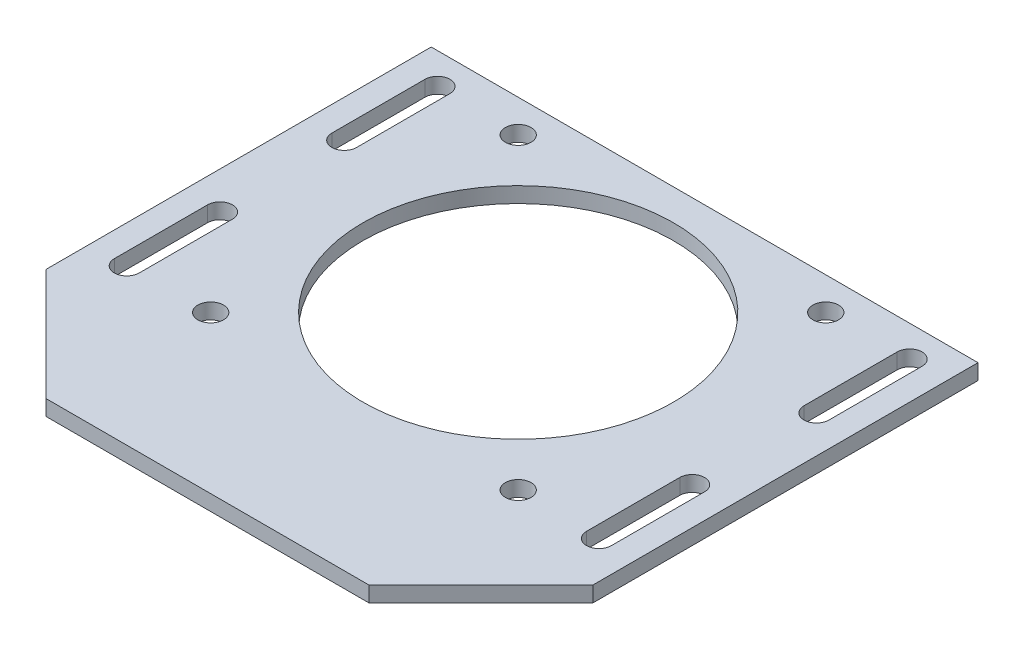
ISO-10303-21;
HEADER;
FILE_DESCRIPTION(('STEP AP214'),'2;1');
FILE_NAME('part.step','',(''),(''),'','','');
FILE_SCHEMA(('AUTOMOTIVE_DESIGN { 1 0 10303 214 1 1 1 1 }'));
ENDSEC;
DATA;
#1=APPLICATION_CONTEXT('core data for automotive mechanical design processes');
#2=APPLICATION_PROTOCOL_DEFINITION('international standard','automotive_design',2000,#1);
#3=PRODUCT_CONTEXT('',#1,'mechanical');
#4=PRODUCT('Part','Part','',(#3));
#5=PRODUCT_RELATED_PRODUCT_CATEGORY('part','',(#4));
#6=PRODUCT_DEFINITION_FORMATION('','',#4);
#7=PRODUCT_DEFINITION_CONTEXT('part definition',#1,'design');
#8=PRODUCT_DEFINITION('design','',#6,#7);
#9=PRODUCT_DEFINITION_SHAPE('','',#8);
#10=(LENGTH_UNIT() NAMED_UNIT(*) SI_UNIT(.MILLI.,.METRE.));
#11=(NAMED_UNIT(*) PLANE_ANGLE_UNIT() SI_UNIT($,.RADIAN.));
#12=(NAMED_UNIT(*) SI_UNIT($,.STERADIAN.) SOLID_ANGLE_UNIT());
#13=UNCERTAINTY_MEASURE_WITH_UNIT(LENGTH_MEASURE(1.E-05),#10,'distance_accuracy_value','');
#14=(GEOMETRIC_REPRESENTATION_CONTEXT(3) GLOBAL_UNCERTAINTY_ASSIGNED_CONTEXT((#13)) GLOBAL_UNIT_ASSIGNED_CONTEXT((#10,
#11,#12)) REPRESENTATION_CONTEXT('',''));
#15=CARTESIAN_POINT('',(0.,0.,0.));
#16=DIRECTION('',(0.,0.,1.));
#17=DIRECTION('',(1.,0.,0.));
#18=AXIS2_PLACEMENT_3D('',#15,#16,#17);
#19=CARTESIAN_POINT('',(0.,0.,0.));
#20=DIRECTION('',(0.,1.,0.));
#21=DIRECTION('',(1.,0.,0.));
#22=AXIS2_PLACEMENT_3D('',#19,#20,#21);
#23=PLANE('',#22);
#24=CARTESIAN_POINT('',(-38.,0.,-20.));
#25=DIRECTION('',(0.,-1.,0.));
#26=DIRECTION('',(1.,0.,0.));
#27=AXIS2_PLACEMENT_3D('',#24,#25,#26);
#28=CIRCLE('',#27,2.);
#29=CARTESIAN_POINT('',(-36.,0.,-20.));
#30=VERTEX_POINT('',#29);
#31=CARTESIAN_POINT('',(-40.,0.,-20.));
#32=VERTEX_POINT('',#31);
#33=EDGE_CURVE('E252',#30,#32,#28,.T.);
#34=ORIENTED_EDGE('',*,*,#33,.F.);
#35=DIRECTION('',(0.,0.,1.));
#36=VECTOR('',#35,1.);
#37=CARTESIAN_POINT('',(-36.,0.,-35.));
#38=LINE('',#37,#36);
#39=CARTESIAN_POINT('',(-36.,0.,-35.));
#40=VERTEX_POINT('',#39);
#41=EDGE_CURVE('E373',#40,#30,#38,.T.);
#42=ORIENTED_EDGE('',*,*,#41,.F.);
#43=CARTESIAN_POINT('',(-38.,0.,-35.));
#44=DIRECTION('',(0.,-1.,0.));
#45=DIRECTION('',(-1.,0.,0.));
#46=AXIS2_PLACEMENT_3D('',#43,#44,#45);
#47=CIRCLE('',#46,2.);
#48=CARTESIAN_POINT('',(-40.,0.,-35.));
#49=VERTEX_POINT('',#48);
#50=EDGE_CURVE('E347',#49,#40,#47,.T.);
#51=ORIENTED_EDGE('',*,*,#50,.F.);
#52=DIRECTION('',(0.,0.,-1.));
#53=VECTOR('',#52,1.);
#54=CARTESIAN_POINT('',(-40.,0.,-20.));
#55=LINE('',#54,#53);
#56=EDGE_CURVE('E462',#32,#49,#55,.T.);
#57=ORIENTED_EDGE('',*,*,#56,.F.);
#58=EDGE_LOOP('',(#34,#42,#51,#57));
#59=FACE_BOUND('',#58,.T.);
#60=CARTESIAN_POINT('',(-38.,0.,15.));
#61=DIRECTION('',(0.,-1.,0.));
#62=DIRECTION('',(1.,0.,0.));
#63=AXIS2_PLACEMENT_3D('',#60,#61,#62);
#64=CIRCLE('',#63,2.);
#65=CARTESIAN_POINT('',(-36.,0.,15.));
#66=VERTEX_POINT('',#65);
#67=CARTESIAN_POINT('',(-40.,0.,15.));
#68=VERTEX_POINT('',#67);
#69=EDGE_CURVE('E216',#66,#68,#64,.T.);
#70=ORIENTED_EDGE('',*,*,#69,.F.);
#71=DIRECTION('',(0.,0.,1.));
#72=VECTOR('',#71,1.);
#73=CARTESIAN_POINT('',(-36.,0.,0.));
#74=LINE('',#73,#72);
#75=CARTESIAN_POINT('',(-36.,0.,0.));
#76=VERTEX_POINT('',#75);
#77=EDGE_CURVE('E221',#76,#66,#74,.T.);
#78=ORIENTED_EDGE('',*,*,#77,.F.);
#79=CARTESIAN_POINT('',(-38.,0.,0.));
#80=DIRECTION('',(0.,-1.,0.));
#81=DIRECTION('',(-1.,0.,0.));
#82=AXIS2_PLACEMENT_3D('',#79,#80,#81);
#83=CIRCLE('',#82,2.);
#84=CARTESIAN_POINT('',(-40.,0.,0.));
#85=VERTEX_POINT('',#84);
#86=EDGE_CURVE('E256',#85,#76,#83,.T.);
#87=ORIENTED_EDGE('',*,*,#86,.F.);
#88=DIRECTION('',(0.,0.,-1.));
#89=VECTOR('',#88,1.);
#90=CARTESIAN_POINT('',(-40.,0.,15.));
#91=LINE('',#90,#89);
#92=EDGE_CURVE('E222',#68,#85,#91,.T.);
#93=ORIENTED_EDGE('',*,*,#92,.F.);
#94=EDGE_LOOP('',(#70,#78,#87,#93));
#95=FACE_BOUND('',#94,.T.);
#96=DIRECTION('',(0.,0.,-1.));
#97=VECTOR('',#96,1.);
#98=CARTESIAN_POINT('',(36.,0.,15.));
#99=LINE('',#98,#97);
#100=CARTESIAN_POINT('',(36.,0.,15.));
#101=VERTEX_POINT('',#100);
#102=CARTESIAN_POINT('',(36.,0.,0.));
#103=VERTEX_POINT('',#102);
#104=EDGE_CURVE('E405',#101,#103,#99,.T.);
#105=ORIENTED_EDGE('',*,*,#104,.F.);
#106=CARTESIAN_POINT('',(38.,0.,15.));
#107=DIRECTION('',(0.,-1.,0.));
#108=DIRECTION('',(1.,0.,0.));
#109=AXIS2_PLACEMENT_3D('',#106,#107,#108);
#110=CIRCLE('',#109,2.);
#111=CARTESIAN_POINT('',(40.,0.,15.));
#112=VERTEX_POINT('',#111);
#113=EDGE_CURVE('E440',#112,#101,#110,.T.);
#114=ORIENTED_EDGE('',*,*,#113,.F.);
#115=DIRECTION('',(0.,0.,1.));
#116=VECTOR('',#115,1.);
#117=CARTESIAN_POINT('',(40.,0.,0.));
#118=LINE('',#117,#116);
#119=CARTESIAN_POINT('',(40.,0.,0.));
#120=VERTEX_POINT('',#119);
#121=EDGE_CURVE('E357',#120,#112,#118,.T.);
#122=ORIENTED_EDGE('',*,*,#121,.F.);
#123=CARTESIAN_POINT('',(38.,0.,0.));
#124=DIRECTION('',(0.,-1.,0.));
#125=DIRECTION('',(-1.,0.,0.));
#126=AXIS2_PLACEMENT_3D('',#123,#124,#125);
#127=CIRCLE('',#126,2.);
#128=EDGE_CURVE('E420',#103,#120,#127,.T.);
#129=ORIENTED_EDGE('',*,*,#128,.F.);
#130=EDGE_LOOP('',(#105,#114,#122,#129));
#131=FACE_BOUND('',#130,.T.);
#132=DIRECTION('',(0.,0.,1.));
#133=VECTOR('',#132,1.);
#134=CARTESIAN_POINT('',(40.,0.,-35.));
#135=LINE('',#134,#133);
#136=CARTESIAN_POINT('',(40.,0.,-35.));
#137=VERTEX_POINT('',#136);
#138=CARTESIAN_POINT('',(40.,0.,-20.));
#139=VERTEX_POINT('',#138);
#140=EDGE_CURVE('E454',#137,#139,#135,.T.);
#141=ORIENTED_EDGE('',*,*,#140,.F.);
#142=CARTESIAN_POINT('',(38.,0.,-35.));
#143=DIRECTION('',(0.,-1.,0.));
#144=DIRECTION('',(-1.,0.,0.));
#145=AXIS2_PLACEMENT_3D('',#142,#143,#144);
#146=CIRCLE('',#145,2.);
#147=CARTESIAN_POINT('',(36.,0.,-35.));
#148=VERTEX_POINT('',#147);
#149=EDGE_CURVE('E268',#148,#137,#146,.T.);
#150=ORIENTED_EDGE('',*,*,#149,.F.);
#151=DIRECTION('',(0.,0.,-1.));
#152=VECTOR('',#151,1.);
#153=CARTESIAN_POINT('',(36.,0.,-20.));
#154=LINE('',#153,#152);
#155=CARTESIAN_POINT('',(36.,0.,-20.));
#156=VERTEX_POINT('',#155);
#157=EDGE_CURVE('E383',#156,#148,#154,.T.);
#158=ORIENTED_EDGE('',*,*,#157,.F.);
#159=CARTESIAN_POINT('',(38.,0.,-20.));
#160=DIRECTION('',(0.,-1.,0.));
#161=DIRECTION('',(1.,0.,0.));
#162=AXIS2_PLACEMENT_3D('',#159,#160,#161);
#163=CIRCLE('',#162,2.);
#164=EDGE_CURVE('E391',#139,#156,#163,.T.);
#165=ORIENTED_EDGE('',*,*,#164,.F.);
#166=EDGE_LOOP('',(#141,#150,#158,#165));
#167=FACE_BOUND('',#166,.T.);
#168=CARTESIAN_POINT('',(0.,0.,-10.));
#169=DIRECTION('',(0.,-1.,0.));
#170=DIRECTION('',(1.,0.,0.));
#171=AXIS2_PLACEMENT_3D('',#168,#169,#170);
#172=CIRCLE('',#171,25.);
#173=CARTESIAN_POINT('',(-25.,0.,-10.));
#174=VERTEX_POINT('',#173);
#175=EDGE_CURVE('E137',#174,#174,#172,.T.);
#176=ORIENTED_EDGE('',*,*,#175,.F.);
#177=EDGE_LOOP('',(#176));
#178=FACE_BOUND('',#177,.T.);
#179=CARTESIAN_POINT('',(24.7487373415292,0.,-34.7487373415292));
#180=DIRECTION('',(0.,1.,0.));
#181=DIRECTION('',(1.,0.,0.));
#182=AXIS2_PLACEMENT_3D('',#179,#180,#181);
#183=CIRCLE('',#182,2.067);
#184=CARTESIAN_POINT('',(22.6817373415292,0.,-34.7487373415292));
#185=VERTEX_POINT('',#184);
#186=EDGE_CURVE('E275',#185,#185,#183,.T.);
#187=ORIENTED_EDGE('',*,*,#186,.T.);
#188=EDGE_LOOP('',(#187));
#189=FACE_BOUND('',#188,.T.);
#190=CARTESIAN_POINT('',(-24.7487373415292,0.,14.7487373415292));
#191=DIRECTION('',(0.,1.,0.));
#192=DIRECTION('',(1.,0.,0.));
#193=AXIS2_PLACEMENT_3D('',#190,#191,#192);
#194=CIRCLE('',#193,2.067);
#195=CARTESIAN_POINT('',(-26.8157373415292,0.,14.7487373415292));
#196=VERTEX_POINT('',#195);
#197=EDGE_CURVE('E261',#196,#196,#194,.T.);
#198=ORIENTED_EDGE('',*,*,#197,.T.);
#199=EDGE_LOOP('',(#198));
#200=FACE_BOUND('',#199,.T.);
#201=CARTESIAN_POINT('',(-24.7487373415292,0.,-34.7487373415292));
#202=DIRECTION('',(0.,1.,0.));
#203=DIRECTION('',(1.,0.,0.));
#204=AXIS2_PLACEMENT_3D('',#201,#202,#203);
#205=CIRCLE('',#204,2.067);
#206=CARTESIAN_POINT('',(-26.8157373415292,0.,-34.7487373415292));
#207=VERTEX_POINT('',#206);
#208=EDGE_CURVE('E322',#207,#207,#205,.T.);
#209=ORIENTED_EDGE('',*,*,#208,.T.);
#210=EDGE_LOOP('',(#209));
#211=FACE_BOUND('',#210,.T.);
#212=CARTESIAN_POINT('',(24.7487373415292,0.,14.7487373415292));
#213=DIRECTION('',(0.,1.,0.));
#214=DIRECTION('',(1.,0.,0.));
#215=AXIS2_PLACEMENT_3D('',#212,#213,#214);
#216=CIRCLE('',#215,2.067);
#217=CARTESIAN_POINT('',(22.6817373415292,0.,14.7487373415292));
#218=VERTEX_POINT('',#217);
#219=EDGE_CURVE('E341',#218,#218,#216,.T.);
#220=ORIENTED_EDGE('',*,*,#219,.T.);
#221=EDGE_LOOP('',(#220));
#222=FACE_BOUND('',#221,.T.);
#223=DIRECTION('',(0.,0.,1.));
#224=VECTOR('',#223,1.);
#225=CARTESIAN_POINT('',(-44.,0.,-40.));
#226=LINE('',#225,#224);
#227=CARTESIAN_POINT('',(-44.,0.,-40.));
#228=VERTEX_POINT('',#227);
#229=CARTESIAN_POINT('',(-44.,0.,22.));
#230=VERTEX_POINT('',#229);
#231=EDGE_CURVE('E28',#228,#230,#226,.T.);
#232=ORIENTED_EDGE('',*,*,#231,.F.);
#233=DIRECTION('',(-1.,0.,0.));
#234=VECTOR('',#233,1.);
#235=CARTESIAN_POINT('',(44.,0.,-40.));
#236=LINE('',#235,#234);
#237=CARTESIAN_POINT('',(44.,0.,-40.));
#238=VERTEX_POINT('',#237);
#239=EDGE_CURVE('E394',#238,#228,#236,.T.);
#240=ORIENTED_EDGE('',*,*,#239,.F.);
#241=DIRECTION('',(0.,0.,-1.));
#242=VECTOR('',#241,1.);
#243=CARTESIAN_POINT('',(44.,0.,22.));
#244=LINE('',#243,#242);
#245=CARTESIAN_POINT('',(44.,0.,22.));
#246=VERTEX_POINT('',#245);
#247=EDGE_CURVE('E276',#246,#238,#244,.T.);
#248=ORIENTED_EDGE('',*,*,#247,.F.);
#249=DIRECTION('',(0.707106781186547,0.,-0.707106781186548));
#250=VECTOR('',#249,1.);
#251=CARTESIAN_POINT('',(26.,0.,40.));
#252=LINE('',#251,#250);
#253=CARTESIAN_POINT('',(26.,0.,40.));
#254=VERTEX_POINT('',#253);
#255=EDGE_CURVE('E333',#254,#246,#252,.T.);
#256=ORIENTED_EDGE('',*,*,#255,.F.);
#257=DIRECTION('',(1.,0.,0.));
#258=VECTOR('',#257,1.);
#259=CARTESIAN_POINT('',(-26.,0.,40.));
#260=LINE('',#259,#258);
#261=CARTESIAN_POINT('',(-26.,0.,40.));
#262=VERTEX_POINT('',#261);
#263=EDGE_CURVE('E346',#262,#254,#260,.T.);
#264=ORIENTED_EDGE('',*,*,#263,.F.);
#265=DIRECTION('',(0.707106781186547,0.,0.707106781186548));
#266=VECTOR('',#265,1.);
#267=CARTESIAN_POINT('',(-44.,0.,22.));
#268=LINE('',#267,#266);
#269=EDGE_CURVE('E361',#230,#262,#268,.T.);
#270=ORIENTED_EDGE('',*,*,#269,.F.);
#271=EDGE_LOOP('',(#232,#240,#248,#256,#264,#270));
#272=FACE_BOUND('',#271,.T.);
#273=ADVANCED_FACE('F17',(#59,#95,#131,#167,#178,#189,#200,#211,#222,#272),#23,.F.);
#274=CARTESIAN_POINT('',(0.,2.5,0.));
#275=DIRECTION('',(0.,1.,0.));
#276=DIRECTION('',(1.,0.,0.));
#277=AXIS2_PLACEMENT_3D('',#274,#275,#276);
#278=PLANE('',#277);
#279=CARTESIAN_POINT('',(-38.,2.5,-20.));
#280=DIRECTION('',(0.,-1.,0.));
#281=DIRECTION('',(1.,0.,0.));
#282=AXIS2_PLACEMENT_3D('',#279,#280,#281);
#283=CIRCLE('',#282,2.);
#284=CARTESIAN_POINT('',(-36.,2.5,-20.));
#285=VERTEX_POINT('',#284);
#286=CARTESIAN_POINT('',(-40.,2.5,-20.));
#287=VERTEX_POINT('',#286);
#288=EDGE_CURVE('E245',#285,#287,#283,.T.);
#289=ORIENTED_EDGE('',*,*,#288,.T.);
#290=DIRECTION('',(0.,0.,-1.));
#291=VECTOR('',#290,1.);
#292=CARTESIAN_POINT('',(-40.,2.5,-20.));
#293=LINE('',#292,#291);
#294=CARTESIAN_POINT('',(-40.,2.5,-35.));
#295=VERTEX_POINT('',#294);
#296=EDGE_CURVE('E401',#287,#295,#293,.T.);
#297=ORIENTED_EDGE('',*,*,#296,.T.);
#298=CARTESIAN_POINT('',(-38.,2.5,-35.));
#299=DIRECTION('',(0.,-1.,0.));
#300=DIRECTION('',(-1.,0.,0.));
#301=AXIS2_PLACEMENT_3D('',#298,#299,#300);
#302=CIRCLE('',#301,2.);
#303=CARTESIAN_POINT('',(-36.,2.5,-35.));
#304=VERTEX_POINT('',#303);
#305=EDGE_CURVE('E351',#295,#304,#302,.T.);
#306=ORIENTED_EDGE('',*,*,#305,.T.);
#307=DIRECTION('',(0.,0.,1.));
#308=VECTOR('',#307,1.);
#309=CARTESIAN_POINT('',(-36.,2.5,-35.));
#310=LINE('',#309,#308);
#311=EDGE_CURVE('E372',#304,#285,#310,.T.);
#312=ORIENTED_EDGE('',*,*,#311,.T.);
#313=EDGE_LOOP('',(#289,#297,#306,#312));
#314=FACE_BOUND('',#313,.T.);
#315=CARTESIAN_POINT('',(-38.,2.5,15.));
#316=DIRECTION('',(0.,-1.,0.));
#317=DIRECTION('',(1.,0.,0.));
#318=AXIS2_PLACEMENT_3D('',#315,#316,#317);
#319=CIRCLE('',#318,2.);
#320=CARTESIAN_POINT('',(-36.,2.5,15.));
#321=VERTEX_POINT('',#320);
#322=CARTESIAN_POINT('',(-40.,2.5,15.));
#323=VERTEX_POINT('',#322);
#324=EDGE_CURVE('E227',#321,#323,#319,.T.);
#325=ORIENTED_EDGE('',*,*,#324,.T.);
#326=DIRECTION('',(0.,0.,-1.));
#327=VECTOR('',#326,1.);
#328=CARTESIAN_POINT('',(-40.,2.5,15.));
#329=LINE('',#328,#327);
#330=CARTESIAN_POINT('',(-40.,2.5,0.));
#331=VERTEX_POINT('',#330);
#332=EDGE_CURVE('E314',#323,#331,#329,.T.);
#333=ORIENTED_EDGE('',*,*,#332,.T.);
#334=CARTESIAN_POINT('',(-38.,2.5,0.));
#335=DIRECTION('',(0.,-1.,0.));
#336=DIRECTION('',(-1.,0.,0.));
#337=AXIS2_PLACEMENT_3D('',#334,#335,#336);
#338=CIRCLE('',#337,2.);
#339=CARTESIAN_POINT('',(-36.,2.5,0.));
#340=VERTEX_POINT('',#339);
#341=EDGE_CURVE('E566',#331,#340,#338,.T.);
#342=ORIENTED_EDGE('',*,*,#341,.T.);
#343=DIRECTION('',(0.,0.,1.));
#344=VECTOR('',#343,1.);
#345=CARTESIAN_POINT('',(-36.,2.5,0.));
#346=LINE('',#345,#344);
#347=EDGE_CURVE('E238',#340,#321,#346,.T.);
#348=ORIENTED_EDGE('',*,*,#347,.T.);
#349=EDGE_LOOP('',(#325,#333,#342,#348));
#350=FACE_BOUND('',#349,.T.);
#351=DIRECTION('',(0.,0.,-1.));
#352=VECTOR('',#351,1.);
#353=CARTESIAN_POINT('',(36.,2.5,15.));
#354=LINE('',#353,#352);
#355=CARTESIAN_POINT('',(36.,2.5,15.));
#356=VERTEX_POINT('',#355);
#357=CARTESIAN_POINT('',(36.,2.5,0.));
#358=VERTEX_POINT('',#357);
#359=EDGE_CURVE('E21',#356,#358,#354,.T.);
#360=ORIENTED_EDGE('',*,*,#359,.T.);
#361=CARTESIAN_POINT('',(38.,2.5,0.));
#362=DIRECTION('',(0.,-1.,0.));
#363=DIRECTION('',(-1.,0.,0.));
#364=AXIS2_PLACEMENT_3D('',#361,#362,#363);
#365=CIRCLE('',#364,2.);
#366=CARTESIAN_POINT('',(40.,2.5,0.));
#367=VERTEX_POINT('',#366);
#368=EDGE_CURVE('E406',#358,#367,#365,.T.);
#369=ORIENTED_EDGE('',*,*,#368,.T.);
#370=DIRECTION('',(0.,0.,1.));
#371=VECTOR('',#370,1.);
#372=CARTESIAN_POINT('',(40.,2.5,0.));
#373=LINE('',#372,#371);
#374=CARTESIAN_POINT('',(40.,2.5,15.));
#375=VERTEX_POINT('',#374);
#376=EDGE_CURVE('E353',#367,#375,#373,.T.);
#377=ORIENTED_EDGE('',*,*,#376,.T.);
#378=CARTESIAN_POINT('',(38.,2.5,15.));
#379=DIRECTION('',(0.,-1.,0.));
#380=DIRECTION('',(1.,0.,0.));
#381=AXIS2_PLACEMENT_3D('',#378,#379,#380);
#382=CIRCLE('',#381,2.);
#383=EDGE_CURVE('E316',#375,#356,#382,.T.);
#384=ORIENTED_EDGE('',*,*,#383,.T.);
#385=EDGE_LOOP('',(#360,#369,#377,#384));
#386=FACE_BOUND('',#385,.T.);
#387=DIRECTION('',(0.,0.,1.));
#388=VECTOR('',#387,1.);
#389=CARTESIAN_POINT('',(40.,2.5,-35.));
#390=LINE('',#389,#388);
#391=CARTESIAN_POINT('',(40.,2.5,-35.));
#392=VERTEX_POINT('',#391);
#393=CARTESIAN_POINT('',(40.,2.5,-20.));
#394=VERTEX_POINT('',#393);
#395=EDGE_CURVE('E416',#392,#394,#390,.T.);
#396=ORIENTED_EDGE('',*,*,#395,.T.);
#397=CARTESIAN_POINT('',(38.,2.5,-20.));
#398=DIRECTION('',(0.,-1.,0.));
#399=DIRECTION('',(1.,0.,0.));
#400=AXIS2_PLACEMENT_3D('',#397,#398,#399);
#401=CIRCLE('',#400,2.);
#402=CARTESIAN_POINT('',(36.,2.5,-20.));
#403=VERTEX_POINT('',#402);
#404=EDGE_CURVE('E428',#394,#403,#401,.T.);
#405=ORIENTED_EDGE('',*,*,#404,.T.);
#406=DIRECTION('',(0.,0.,-1.));
#407=VECTOR('',#406,1.);
#408=CARTESIAN_POINT('',(36.,2.5,-20.));
#409=LINE('',#408,#407);
#410=CARTESIAN_POINT('',(36.,2.5,-35.));
#411=VERTEX_POINT('',#410);
#412=EDGE_CURVE('E379',#403,#411,#409,.T.);
#413=ORIENTED_EDGE('',*,*,#412,.T.);
#414=CARTESIAN_POINT('',(38.,2.5,-35.));
#415=DIRECTION('',(0.,-1.,0.));
#416=DIRECTION('',(-1.,0.,0.));
#417=AXIS2_PLACEMENT_3D('',#414,#415,#416);
#418=CIRCLE('',#417,2.);
#419=EDGE_CURVE('E424',#411,#392,#418,.T.);
#420=ORIENTED_EDGE('',*,*,#419,.T.);
#421=EDGE_LOOP('',(#396,#405,#413,#420));
#422=FACE_BOUND('',#421,.T.);
#423=CARTESIAN_POINT('',(0.,2.5,-10.));
#424=DIRECTION('',(0.,-1.,0.));
#425=DIRECTION('',(1.,0.,0.));
#426=AXIS2_PLACEMENT_3D('',#423,#424,#425);
#427=CIRCLE('',#426,25.);
#428=CARTESIAN_POINT('',(-25.,2.5,-10.));
#429=VERTEX_POINT('',#428);
#430=EDGE_CURVE('E413',#429,#429,#427,.T.);
#431=ORIENTED_EDGE('',*,*,#430,.T.);
#432=EDGE_LOOP('',(#431));
#433=FACE_BOUND('',#432,.T.);
#434=CARTESIAN_POINT('',(24.7487373415292,2.5,-34.7487373415292));
#435=DIRECTION('',(0.,-1.,0.));
#436=DIRECTION('',(1.,0.,0.));
#437=AXIS2_PLACEMENT_3D('',#434,#435,#436);
#438=CIRCLE('',#437,2.067);
#439=CARTESIAN_POINT('',(22.6817373415292,2.5,-34.7487373415292));
#440=VERTEX_POINT('',#439);
#441=EDGE_CURVE('E263',#440,#440,#438,.T.);
#442=ORIENTED_EDGE('',*,*,#441,.T.);
#443=EDGE_LOOP('',(#442));
#444=FACE_BOUND('',#443,.T.);
#445=CARTESIAN_POINT('',(-24.7487373415292,2.5,14.7487373415292));
#446=DIRECTION('',(0.,-1.,0.));
#447=DIRECTION('',(1.,0.,0.));
#448=AXIS2_PLACEMENT_3D('',#445,#446,#447);
#449=CIRCLE('',#448,2.067);
#450=CARTESIAN_POINT('',(-26.8157373415292,2.5,14.7487373415292));
#451=VERTEX_POINT('',#450);
#452=EDGE_CURVE('E262',#451,#451,#449,.T.);
#453=ORIENTED_EDGE('',*,*,#452,.T.);
#454=EDGE_LOOP('',(#453));
#455=FACE_BOUND('',#454,.T.);
#456=CARTESIAN_POINT('',(-24.7487373415292,2.5,-34.7487373415292));
#457=DIRECTION('',(0.,-1.,0.));
#458=DIRECTION('',(1.,0.,0.));
#459=AXIS2_PLACEMENT_3D('',#456,#457,#458);
#460=CIRCLE('',#459,2.067);
#461=CARTESIAN_POINT('',(-26.8157373415292,2.5,-34.7487373415292));
#462=VERTEX_POINT('',#461);
#463=EDGE_CURVE('E337',#462,#462,#460,.T.);
#464=ORIENTED_EDGE('',*,*,#463,.T.);
#465=EDGE_LOOP('',(#464));
#466=FACE_BOUND('',#465,.T.);
#467=CARTESIAN_POINT('',(24.7487373415292,2.5,14.7487373415292));
#468=DIRECTION('',(0.,-1.,0.));
#469=DIRECTION('',(1.,0.,0.));
#470=AXIS2_PLACEMENT_3D('',#467,#468,#469);
#471=CIRCLE('',#470,2.067);
#472=CARTESIAN_POINT('',(22.6817373415292,2.5,14.7487373415292));
#473=VERTEX_POINT('',#472);
#474=EDGE_CURVE('E326',#473,#473,#471,.T.);
#475=ORIENTED_EDGE('',*,*,#474,.T.);
#476=EDGE_LOOP('',(#475));
#477=FACE_BOUND('',#476,.T.);
#478=DIRECTION('',(0.,0.,1.));
#479=VECTOR('',#478,1.);
#480=CARTESIAN_POINT('',(-44.,2.5,-40.));
#481=LINE('',#480,#479);
#482=CARTESIAN_POINT('',(-44.,2.5,-40.));
#483=VERTEX_POINT('',#482);
#484=CARTESIAN_POINT('',(-44.,2.5,22.));
#485=VERTEX_POINT('',#484);
#486=EDGE_CURVE('E11',#483,#485,#481,.T.);
#487=ORIENTED_EDGE('',*,*,#486,.T.);
#488=DIRECTION('',(0.707106781186547,0.,0.707106781186548));
#489=VECTOR('',#488,1.);
#490=CARTESIAN_POINT('',(-44.,2.5,22.));
#491=LINE('',#490,#489);
#492=CARTESIAN_POINT('',(-26.,2.5,40.));
#493=VERTEX_POINT('',#492);
#494=EDGE_CURVE('E358',#485,#493,#491,.T.);
#495=ORIENTED_EDGE('',*,*,#494,.T.);
#496=DIRECTION('',(1.,0.,0.));
#497=VECTOR('',#496,1.);
#498=CARTESIAN_POINT('',(-26.,2.5,40.));
#499=LINE('',#498,#497);
#500=CARTESIAN_POINT('',(26.,2.5,40.));
#501=VERTEX_POINT('',#500);
#502=EDGE_CURVE('E342',#493,#501,#499,.T.);
#503=ORIENTED_EDGE('',*,*,#502,.T.);
#504=DIRECTION('',(0.707106781186547,0.,-0.707106781186548));
#505=VECTOR('',#504,1.);
#506=CARTESIAN_POINT('',(26.,2.5,40.));
#507=LINE('',#506,#505);
#508=CARTESIAN_POINT('',(44.,2.5,22.));
#509=VERTEX_POINT('',#508);
#510=EDGE_CURVE('E336',#501,#509,#507,.T.);
#511=ORIENTED_EDGE('',*,*,#510,.T.);
#512=DIRECTION('',(0.,0.,-1.));
#513=VECTOR('',#512,1.);
#514=CARTESIAN_POINT('',(44.,2.5,22.));
#515=LINE('',#514,#513);
#516=CARTESIAN_POINT('',(44.,2.5,-40.));
#517=VERTEX_POINT('',#516);
#518=EDGE_CURVE('E278',#509,#517,#515,.T.);
#519=ORIENTED_EDGE('',*,*,#518,.T.);
#520=DIRECTION('',(-1.,0.,0.));
#521=VECTOR('',#520,1.);
#522=CARTESIAN_POINT('',(44.,2.5,-40.));
#523=LINE('',#522,#521);
#524=EDGE_CURVE('E292',#517,#483,#523,.T.);
#525=ORIENTED_EDGE('',*,*,#524,.T.);
#526=EDGE_LOOP('',(#487,#495,#503,#511,#519,#525));
#527=FACE_BOUND('',#526,.T.);
#528=ADVANCED_FACE('F501',(#314,#350,#386,#422,#433,#444,#455,#466,#477,#527),#278,.T.);
#529=CARTESIAN_POINT('',(-44.,0.,-40.));
#530=DIRECTION('',(-1.,0.,0.));
#531=DIRECTION('',(0.,1.,0.));
#532=AXIS2_PLACEMENT_3D('',#529,#530,#531);
#533=PLANE('',#532);
#534=ORIENTED_EDGE('',*,*,#231,.T.);
#535=DIRECTION('',(0.,1.,0.));
#536=VECTOR('',#535,1.);
#537=CARTESIAN_POINT('',(-44.,0.,22.));
#538=LINE('',#537,#536);
#539=EDGE_CURVE('E311',#230,#485,#538,.T.);
#540=ORIENTED_EDGE('',*,*,#539,.T.);
#541=ORIENTED_EDGE('',*,*,#486,.F.);
#542=DIRECTION('',(0.,1.,0.));
#543=VECTOR('',#542,1.);
#544=CARTESIAN_POINT('',(-44.,0.,-40.));
#545=LINE('',#544,#543);
#546=EDGE_CURVE('E300',#228,#483,#545,.T.);
#547=ORIENTED_EDGE('',*,*,#546,.F.);
#548=EDGE_LOOP('',(#534,#540,#541,#547));
#549=FACE_BOUND('',#548,.T.);
#550=ADVANCED_FACE('F708',(#549),#533,.T.);
#551=CARTESIAN_POINT('',(-44.,0.,22.));
#552=DIRECTION('',(-0.707106781186548,0.,0.707106781186547));
#553=DIRECTION('',(0.,1.,0.));
#554=AXIS2_PLACEMENT_3D('',#551,#552,#553);
#555=PLANE('',#554);
#556=ORIENTED_EDGE('',*,*,#269,.T.);
#557=DIRECTION('',(0.,1.,0.));
#558=VECTOR('',#557,1.);
#559=CARTESIAN_POINT('',(-26.,0.,40.));
#560=LINE('',#559,#558);
#561=EDGE_CURVE('E345',#262,#493,#560,.T.);
#562=ORIENTED_EDGE('',*,*,#561,.T.);
#563=ORIENTED_EDGE('',*,*,#494,.F.);
#564=ORIENTED_EDGE('',*,*,#539,.F.);
#565=EDGE_LOOP('',(#556,#562,#563,#564));
#566=FACE_BOUND('',#565,.T.);
#567=ADVANCED_FACE('F657',(#566),#555,.T.);
#568=CARTESIAN_POINT('',(-26.,0.,40.));
#569=DIRECTION('',(0.,0.,1.));
#570=DIRECTION('',(1.,0.,0.));
#571=AXIS2_PLACEMENT_3D('',#568,#569,#570);
#572=PLANE('',#571);
#573=ORIENTED_EDGE('',*,*,#263,.T.);
#574=DIRECTION('',(0.,1.,0.));
#575=VECTOR('',#574,1.);
#576=CARTESIAN_POINT('',(26.,0.,40.));
#577=LINE('',#576,#575);
#578=EDGE_CURVE('E376',#254,#501,#577,.T.);
#579=ORIENTED_EDGE('',*,*,#578,.T.);
#580=ORIENTED_EDGE('',*,*,#502,.F.);
#581=ORIENTED_EDGE('',*,*,#561,.F.);
#582=EDGE_LOOP('',(#573,#579,#580,#581));
#583=FACE_BOUND('',#582,.T.);
#584=ADVANCED_FACE('F495',(#583),#572,.T.);
#585=CARTESIAN_POINT('',(26.,0.,40.));
#586=DIRECTION('',(0.707106781186548,0.,0.707106781186547));
#587=DIRECTION('',(0.,-1.,0.));
#588=AXIS2_PLACEMENT_3D('',#585,#586,#587);
#589=PLANE('',#588);
#590=ORIENTED_EDGE('',*,*,#255,.T.);
#591=DIRECTION('',(0.,1.,0.));
#592=VECTOR('',#591,1.);
#593=CARTESIAN_POINT('',(44.,0.,22.));
#594=LINE('',#593,#592);
#595=EDGE_CURVE('E289',#246,#509,#594,.T.);
#596=ORIENTED_EDGE('',*,*,#595,.T.);
#597=ORIENTED_EDGE('',*,*,#510,.F.);
#598=ORIENTED_EDGE('',*,*,#578,.F.);
#599=EDGE_LOOP('',(#590,#596,#597,#598));
#600=FACE_BOUND('',#599,.T.);
#601=ADVANCED_FACE('F500',(#600),#589,.T.);
#602=CARTESIAN_POINT('',(44.,0.,22.));
#603=DIRECTION('',(1.,0.,0.));
#604=DIRECTION('',(0.,0.,-1.));
#605=AXIS2_PLACEMENT_3D('',#602,#603,#604);
#606=PLANE('',#605);
#607=ORIENTED_EDGE('',*,*,#247,.T.);
#608=DIRECTION('',(0.,1.,0.));
#609=VECTOR('',#608,1.);
#610=CARTESIAN_POINT('',(44.,0.,-40.));
#611=LINE('',#610,#609);
#612=EDGE_CURVE('E279',#238,#517,#611,.T.);
#613=ORIENTED_EDGE('',*,*,#612,.T.);
#614=ORIENTED_EDGE('',*,*,#518,.F.);
#615=ORIENTED_EDGE('',*,*,#595,.F.);
#616=EDGE_LOOP('',(#607,#613,#614,#615));
#617=FACE_BOUND('',#616,.T.);
#618=ADVANCED_FACE('F670',(#617),#606,.T.);
#619=CARTESIAN_POINT('',(44.,0.,-40.));
#620=DIRECTION('',(0.,0.,-1.));
#621=DIRECTION('',(0.,-1.,0.));
#622=AXIS2_PLACEMENT_3D('',#619,#620,#621);
#623=PLANE('',#622);
#624=ORIENTED_EDGE('',*,*,#239,.T.);
#625=ORIENTED_EDGE('',*,*,#546,.T.);
#626=ORIENTED_EDGE('',*,*,#524,.F.);
#627=ORIENTED_EDGE('',*,*,#612,.F.);
#628=EDGE_LOOP('',(#624,#625,#626,#627));
#629=FACE_BOUND('',#628,.T.);
#630=ADVANCED_FACE('F664',(#629),#623,.T.);
#631=CARTESIAN_POINT('',(0.,0.,-10.));
#632=DIRECTION('',(0.,1.,0.));
#633=DIRECTION('',(1.,0.,0.));
#634=AXIS2_PLACEMENT_3D('',#631,#632,#633);
#635=CYLINDRICAL_SURFACE('',#634,25.);
#636=ORIENTED_EDGE('',*,*,#430,.F.);
#637=DIRECTION('',(0.,-1.,0.));
#638=VECTOR('',#637,1.);
#639=CARTESIAN_POINT('',(-25.,0.,-10.));
#640=LINE('',#639,#638);
#641=EDGE_CURVE('E143',#429,#174,#640,.T.);
#642=ORIENTED_EDGE('',*,*,#641,.T.);
#643=ORIENTED_EDGE('',*,*,#175,.T.);
#644=ORIENTED_EDGE('',*,*,#641,.F.);
#645=EDGE_LOOP('',(#636,#642,#643,#644));
#646=FACE_BOUND('',#645,.T.);
#647=ADVANCED_FACE('F669',(#646),#635,.F.);
#648=CARTESIAN_POINT('',(40.,0.,-35.));
#649=DIRECTION('',(-1.,0.,0.));
#650=DIRECTION('',(0.,0.,1.));
#651=AXIS2_PLACEMENT_3D('',#648,#649,#650);
#652=PLANE('',#651);
#653=ORIENTED_EDGE('',*,*,#140,.T.);
#654=DIRECTION('',(0.,1.,0.));
#655=VECTOR('',#654,1.);
#656=CARTESIAN_POINT('',(40.,0.,-20.));
#657=LINE('',#656,#655);
#658=EDGE_CURVE('E450',#139,#394,#657,.T.);
#659=ORIENTED_EDGE('',*,*,#658,.T.);
#660=ORIENTED_EDGE('',*,*,#395,.F.);
#661=DIRECTION('',(0.,1.,0.));
#662=VECTOR('',#661,1.);
#663=CARTESIAN_POINT('',(40.,0.,-35.));
#664=LINE('',#663,#662);
#665=EDGE_CURVE('E272',#137,#392,#664,.T.);
#666=ORIENTED_EDGE('',*,*,#665,.F.);
#667=EDGE_LOOP('',(#653,#659,#660,#666));
#668=FACE_BOUND('',#667,.T.);
#669=ADVANCED_FACE('F699',(#668),#652,.T.);
#670=CARTESIAN_POINT('',(38.,0.,-20.));
#671=DIRECTION('',(0.,1.,0.));
#672=DIRECTION('',(1.,0.,0.));
#673=AXIS2_PLACEMENT_3D('',#670,#671,#672);
#674=CYLINDRICAL_SURFACE('',#673,2.);
#675=ORIENTED_EDGE('',*,*,#164,.T.);
#676=DIRECTION('',(0.,1.,0.));
#677=VECTOR('',#676,1.);
#678=CARTESIAN_POINT('',(36.,0.,-20.));
#679=LINE('',#678,#677);
#680=EDGE_CURVE('E382',#156,#403,#679,.T.);
#681=ORIENTED_EDGE('',*,*,#680,.T.);
#682=ORIENTED_EDGE('',*,*,#404,.F.);
#683=ORIENTED_EDGE('',*,*,#658,.F.);
#684=EDGE_LOOP('',(#675,#681,#682,#683));
#685=FACE_BOUND('',#684,.T.);
#686=ADVANCED_FACE('F19',(#685),#674,.F.);
#687=CARTESIAN_POINT('',(36.,0.,-20.));
#688=DIRECTION('',(1.,0.,0.));
#689=DIRECTION('',(0.,0.,1.));
#690=AXIS2_PLACEMENT_3D('',#687,#688,#689);
#691=PLANE('',#690);
#692=ORIENTED_EDGE('',*,*,#157,.T.);
#693=DIRECTION('',(0.,1.,0.));
#694=VECTOR('',#693,1.);
#695=CARTESIAN_POINT('',(36.,0.,-35.));
#696=LINE('',#695,#694);
#697=EDGE_CURVE('E304',#148,#411,#696,.T.);
#698=ORIENTED_EDGE('',*,*,#697,.T.);
#699=ORIENTED_EDGE('',*,*,#412,.F.);
#700=ORIENTED_EDGE('',*,*,#680,.F.);
#701=EDGE_LOOP('',(#692,#698,#699,#700));
#702=FACE_BOUND('',#701,.T.);
#703=ADVANCED_FACE('F640',(#702),#691,.T.);
#704=CARTESIAN_POINT('',(38.,0.,-35.));
#705=DIRECTION('',(0.,1.,0.));
#706=DIRECTION('',(-1.,0.,0.));
#707=AXIS2_PLACEMENT_3D('',#704,#705,#706);
#708=CYLINDRICAL_SURFACE('',#707,2.);
#709=ORIENTED_EDGE('',*,*,#149,.T.);
#710=ORIENTED_EDGE('',*,*,#665,.T.);
#711=ORIENTED_EDGE('',*,*,#419,.F.);
#712=ORIENTED_EDGE('',*,*,#697,.F.);
#713=EDGE_LOOP('',(#709,#710,#711,#712));
#714=FACE_BOUND('',#713,.T.);
#715=ADVANCED_FACE('F645',(#714),#708,.F.);
#716=CARTESIAN_POINT('',(36.,0.,15.));
#717=DIRECTION('',(1.,0.,0.));
#718=DIRECTION('',(0.,0.,1.));
#719=AXIS2_PLACEMENT_3D('',#716,#717,#718);
#720=PLANE('',#719);
#721=ORIENTED_EDGE('',*,*,#104,.T.);
#722=DIRECTION('',(0.,1.,0.));
#723=VECTOR('',#722,1.);
#724=CARTESIAN_POINT('',(36.,0.,0.));
#725=LINE('',#724,#723);
#726=EDGE_CURVE('E402',#103,#358,#725,.T.);
#727=ORIENTED_EDGE('',*,*,#726,.T.);
#728=ORIENTED_EDGE('',*,*,#359,.F.);
#729=DIRECTION('',(0.,1.,0.));
#730=VECTOR('',#729,1.);
#731=CARTESIAN_POINT('',(36.,0.,15.));
#732=LINE('',#731,#730);
#733=EDGE_CURVE('E321',#101,#356,#732,.T.);
#734=ORIENTED_EDGE('',*,*,#733,.F.);
#735=EDGE_LOOP('',(#721,#727,#728,#734));
#736=FACE_BOUND('',#735,.T.);
#737=ADVANCED_FACE('F601',(#736),#720,.T.);
#738=CARTESIAN_POINT('',(38.,0.,0.));
#739=DIRECTION('',(0.,1.,0.));
#740=DIRECTION('',(-1.,0.,0.));
#741=AXIS2_PLACEMENT_3D('',#738,#739,#740);
#742=CYLINDRICAL_SURFACE('',#741,2.);
#743=ORIENTED_EDGE('',*,*,#128,.T.);
#744=DIRECTION('',(0.,1.,0.));
#745=VECTOR('',#744,1.);
#746=CARTESIAN_POINT('',(40.,0.,0.));
#747=LINE('',#746,#745);
#748=EDGE_CURVE('E356',#120,#367,#747,.T.);
#749=ORIENTED_EDGE('',*,*,#748,.T.);
#750=ORIENTED_EDGE('',*,*,#368,.F.);
#751=ORIENTED_EDGE('',*,*,#726,.F.);
#752=EDGE_LOOP('',(#743,#749,#750,#751));
#753=FACE_BOUND('',#752,.T.);
#754=ADVANCED_FACE('F589',(#753),#742,.F.);
#755=CARTESIAN_POINT('',(40.,0.,0.));
#756=DIRECTION('',(-1.,0.,0.));
#757=DIRECTION('',(0.,1.,0.));
#758=AXIS2_PLACEMENT_3D('',#755,#756,#757);
#759=PLANE('',#758);
#760=ORIENTED_EDGE('',*,*,#121,.T.);
#761=DIRECTION('',(0.,1.,0.));
#762=VECTOR('',#761,1.);
#763=CARTESIAN_POINT('',(40.,0.,15.));
#764=LINE('',#763,#762);
#765=EDGE_CURVE('E320',#112,#375,#764,.T.);
#766=ORIENTED_EDGE('',*,*,#765,.T.);
#767=ORIENTED_EDGE('',*,*,#376,.F.);
#768=ORIENTED_EDGE('',*,*,#748,.F.);
#769=EDGE_LOOP('',(#760,#766,#767,#768));
#770=FACE_BOUND('',#769,.T.);
#771=ADVANCED_FACE('F593',(#770),#759,.T.);
#772=CARTESIAN_POINT('',(38.,0.,15.));
#773=DIRECTION('',(0.,1.,0.));
#774=DIRECTION('',(1.,0.,0.));
#775=AXIS2_PLACEMENT_3D('',#772,#773,#774);
#776=CYLINDRICAL_SURFACE('',#775,2.);
#777=ORIENTED_EDGE('',*,*,#113,.T.);
#778=ORIENTED_EDGE('',*,*,#733,.T.);
#779=ORIENTED_EDGE('',*,*,#383,.F.);
#780=ORIENTED_EDGE('',*,*,#765,.F.);
#781=EDGE_LOOP('',(#777,#778,#779,#780));
#782=FACE_BOUND('',#781,.T.);
#783=ADVANCED_FACE('F598',(#782),#776,.F.);
#784=CARTESIAN_POINT('',(-38.,0.,15.));
#785=DIRECTION('',(0.,1.,0.));
#786=DIRECTION('',(1.,0.,0.));
#787=AXIS2_PLACEMENT_3D('',#784,#785,#786);
#788=CYLINDRICAL_SURFACE('',#787,2.);
#789=ORIENTED_EDGE('',*,*,#69,.T.);
#790=DIRECTION('',(0.,1.,0.));
#791=VECTOR('',#790,1.);
#792=CARTESIAN_POINT('',(-40.,0.,15.));
#793=LINE('',#792,#791);
#794=EDGE_CURVE('E228',#68,#323,#793,.T.);
#795=ORIENTED_EDGE('',*,*,#794,.T.);
#796=ORIENTED_EDGE('',*,*,#324,.F.);
#797=DIRECTION('',(0.,1.,0.));
#798=VECTOR('',#797,1.);
#799=CARTESIAN_POINT('',(-36.,0.,15.));
#800=LINE('',#799,#798);
#801=EDGE_CURVE('E231',#66,#321,#800,.T.);
#802=ORIENTED_EDGE('',*,*,#801,.F.);
#803=EDGE_LOOP('',(#789,#795,#796,#802));
#804=FACE_BOUND('',#803,.T.);
#805=ADVANCED_FACE('F232',(#804),#788,.F.);
#806=CARTESIAN_POINT('',(-40.,0.,15.));
#807=DIRECTION('',(1.,0.,0.));
#808=DIRECTION('',(0.,0.,-1.));
#809=AXIS2_PLACEMENT_3D('',#806,#807,#808);
#810=PLANE('',#809);
#811=ORIENTED_EDGE('',*,*,#92,.T.);
#812=DIRECTION('',(0.,1.,0.));
#813=VECTOR('',#812,1.);
#814=CARTESIAN_POINT('',(-40.,0.,0.));
#815=LINE('',#814,#813);
#816=EDGE_CURVE('E315',#85,#331,#815,.T.);
#817=ORIENTED_EDGE('',*,*,#816,.T.);
#818=ORIENTED_EDGE('',*,*,#332,.F.);
#819=ORIENTED_EDGE('',*,*,#794,.F.);
#820=EDGE_LOOP('',(#811,#817,#818,#819));
#821=FACE_BOUND('',#820,.T.);
#822=ADVANCED_FACE('F718',(#821),#810,.T.);
#823=CARTESIAN_POINT('',(-38.,0.,0.));
#824=DIRECTION('',(0.,1.,0.));
#825=DIRECTION('',(-1.,0.,0.));
#826=AXIS2_PLACEMENT_3D('',#823,#824,#825);
#827=CYLINDRICAL_SURFACE('',#826,2.);
#828=ORIENTED_EDGE('',*,*,#86,.T.);
#829=DIRECTION('',(0.,1.,0.));
#830=VECTOR('',#829,1.);
#831=CARTESIAN_POINT('',(-36.,0.,0.));
#832=LINE('',#831,#830);
#833=EDGE_CURVE('E243',#76,#340,#832,.T.);
#834=ORIENTED_EDGE('',*,*,#833,.T.);
#835=ORIENTED_EDGE('',*,*,#341,.F.);
#836=ORIENTED_EDGE('',*,*,#816,.F.);
#837=EDGE_LOOP('',(#828,#834,#835,#836));
#838=FACE_BOUND('',#837,.T.);
#839=ADVANCED_FACE('F681',(#838),#827,.F.);
#840=CARTESIAN_POINT('',(-36.,0.,0.));
#841=DIRECTION('',(-1.,0.,0.));
#842=DIRECTION('',(0.,1.,0.));
#843=AXIS2_PLACEMENT_3D('',#840,#841,#842);
#844=PLANE('',#843);
#845=ORIENTED_EDGE('',*,*,#77,.T.);
#846=ORIENTED_EDGE('',*,*,#801,.T.);
#847=ORIENTED_EDGE('',*,*,#347,.F.);
#848=ORIENTED_EDGE('',*,*,#833,.F.);
#849=EDGE_LOOP('',(#845,#846,#847,#848));
#850=FACE_BOUND('',#849,.T.);
#851=ADVANCED_FACE('F241',(#850),#844,.T.);
#852=CARTESIAN_POINT('',(-38.,0.,-20.));
#853=DIRECTION('',(0.,1.,0.));
#854=DIRECTION('',(1.,0.,0.));
#855=AXIS2_PLACEMENT_3D('',#852,#853,#854);
#856=CYLINDRICAL_SURFACE('',#855,2.);
#857=ORIENTED_EDGE('',*,*,#33,.T.);
#858=DIRECTION('',(0.,1.,0.));
#859=VECTOR('',#858,1.);
#860=CARTESIAN_POINT('',(-40.,0.,-20.));
#861=LINE('',#860,#859);
#862=EDGE_CURVE('E308',#32,#287,#861,.T.);
#863=ORIENTED_EDGE('',*,*,#862,.T.);
#864=ORIENTED_EDGE('',*,*,#288,.F.);
#865=DIRECTION('',(0.,1.,0.));
#866=VECTOR('',#865,1.);
#867=CARTESIAN_POINT('',(-36.,0.,-20.));
#868=LINE('',#867,#866);
#869=EDGE_CURVE('E368',#30,#285,#868,.T.);
#870=ORIENTED_EDGE('',*,*,#869,.F.);
#871=EDGE_LOOP('',(#857,#863,#864,#870));
#872=FACE_BOUND('',#871,.T.);
#873=ADVANCED_FACE('F524',(#872),#856,.F.);
#874=CARTESIAN_POINT('',(-40.,0.,-20.));
#875=DIRECTION('',(1.,0.,0.));
#876=DIRECTION('',(0.,0.,-1.));
#877=AXIS2_PLACEMENT_3D('',#874,#875,#876);
#878=PLANE('',#877);
#879=ORIENTED_EDGE('',*,*,#56,.T.);
#880=DIRECTION('',(0.,1.,0.));
#881=VECTOR('',#880,1.);
#882=CARTESIAN_POINT('',(-40.,0.,-35.));
#883=LINE('',#882,#881);
#884=EDGE_CURVE('E412',#49,#295,#883,.T.);
#885=ORIENTED_EDGE('',*,*,#884,.T.);
#886=ORIENTED_EDGE('',*,*,#296,.F.);
#887=ORIENTED_EDGE('',*,*,#862,.F.);
#888=EDGE_LOOP('',(#879,#885,#886,#887));
#889=FACE_BOUND('',#888,.T.);
#890=ADVANCED_FACE('F557',(#889),#878,.T.);
#891=CARTESIAN_POINT('',(-38.,0.,-35.));
#892=DIRECTION('',(0.,1.,0.));
#893=DIRECTION('',(-1.,0.,0.));
#894=AXIS2_PLACEMENT_3D('',#891,#892,#893);
#895=CYLINDRICAL_SURFACE('',#894,2.);
#896=ORIENTED_EDGE('',*,*,#50,.T.);
#897=DIRECTION('',(0.,1.,0.));
#898=VECTOR('',#897,1.);
#899=CARTESIAN_POINT('',(-36.,0.,-35.));
#900=LINE('',#899,#898);
#901=EDGE_CURVE('E352',#40,#304,#900,.T.);
#902=ORIENTED_EDGE('',*,*,#901,.T.);
#903=ORIENTED_EDGE('',*,*,#305,.F.);
#904=ORIENTED_EDGE('',*,*,#884,.F.);
#905=EDGE_LOOP('',(#896,#902,#903,#904));
#906=FACE_BOUND('',#905,.T.);
#907=ADVANCED_FACE('F807',(#906),#895,.F.);
#908=CARTESIAN_POINT('',(-36.,0.,-35.));
#909=DIRECTION('',(-1.,0.,0.));
#910=DIRECTION('',(0.,1.,0.));
#911=AXIS2_PLACEMENT_3D('',#908,#909,#910);
#912=PLANE('',#911);
#913=ORIENTED_EDGE('',*,*,#41,.T.);
#914=ORIENTED_EDGE('',*,*,#869,.T.);
#915=ORIENTED_EDGE('',*,*,#311,.F.);
#916=ORIENTED_EDGE('',*,*,#901,.F.);
#917=EDGE_LOOP('',(#913,#914,#915,#916));
#918=FACE_BOUND('',#917,.T.);
#919=ADVANCED_FACE('F533',(#918),#912,.T.);
#920=CARTESIAN_POINT('',(24.7487373415292,-116.454823357441,-34.7487373415292));
#921=DIRECTION('',(0.,1.,0.));
#922=DIRECTION('',(1.,0.,0.));
#923=AXIS2_PLACEMENT_3D('',#920,#921,#922);
#924=CYLINDRICAL_SURFACE('',#923,2.067);
#925=ORIENTED_EDGE('',*,*,#441,.F.);
#926=DIRECTION('',(0.,-1.,0.));
#927=VECTOR('',#926,1.);
#928=CARTESIAN_POINT('',(22.6817373415292,-116.454823357441,-34.7487373415292));
#929=LINE('',#928,#927);
#930=EDGE_CURVE('E267',#440,#185,#929,.T.);
#931=ORIENTED_EDGE('',*,*,#930,.T.);
#932=ORIENTED_EDGE('',*,*,#186,.F.);
#933=ORIENTED_EDGE('',*,*,#930,.F.);
#934=EDGE_LOOP('',(#925,#931,#932,#933));
#935=FACE_BOUND('',#934,.T.);
#936=ADVANCED_FACE('F606',(#935),#924,.F.);
#937=CARTESIAN_POINT('',(-24.7487373415292,-116.454823357441,14.7487373415292));
#938=DIRECTION('',(0.,1.,0.));
#939=DIRECTION('',(1.,0.,0.));
#940=AXIS2_PLACEMENT_3D('',#937,#938,#939);
#941=CYLINDRICAL_SURFACE('',#940,2.067);
#942=ORIENTED_EDGE('',*,*,#452,.F.);
#943=DIRECTION('',(0.,-1.,0.));
#944=VECTOR('',#943,1.);
#945=CARTESIAN_POINT('',(-26.8157373415292,-116.454823357441,14.7487373415292));
#946=LINE('',#945,#944);
#947=EDGE_CURVE('E258',#451,#196,#946,.T.);
#948=ORIENTED_EDGE('',*,*,#947,.T.);
#949=ORIENTED_EDGE('',*,*,#197,.F.);
#950=ORIENTED_EDGE('',*,*,#947,.F.);
#951=EDGE_LOOP('',(#942,#948,#949,#950));
#952=FACE_BOUND('',#951,.T.);
#953=ADVANCED_FACE('F611',(#952),#941,.F.);
#954=CARTESIAN_POINT('',(-24.7487373415292,-116.454823357441,-34.7487373415292));
#955=DIRECTION('',(0.,1.,0.));
#956=DIRECTION('',(1.,0.,0.));
#957=AXIS2_PLACEMENT_3D('',#954,#955,#956);
#958=CYLINDRICAL_SURFACE('',#957,2.067);
#959=ORIENTED_EDGE('',*,*,#463,.F.);
#960=DIRECTION('',(0.,-1.,0.));
#961=VECTOR('',#960,1.);
#962=CARTESIAN_POINT('',(-26.8157373415292,-116.454823357441,-34.7487373415292));
#963=LINE('',#962,#961);
#964=EDGE_CURVE('E325',#462,#207,#963,.T.);
#965=ORIENTED_EDGE('',*,*,#964,.T.);
#966=ORIENTED_EDGE('',*,*,#208,.F.);
#967=ORIENTED_EDGE('',*,*,#964,.F.);
#968=EDGE_LOOP('',(#959,#965,#966,#967));
#969=FACE_BOUND('',#968,.T.);
#970=ADVANCED_FACE('F633',(#969),#958,.F.);
#971=CARTESIAN_POINT('',(24.7487373415292,-116.454823357441,14.7487373415292));
#972=DIRECTION('',(0.,1.,0.));
#973=DIRECTION('',(1.,0.,0.));
#974=AXIS2_PLACEMENT_3D('',#971,#972,#973);
#975=CYLINDRICAL_SURFACE('',#974,2.067);
#976=ORIENTED_EDGE('',*,*,#474,.F.);
#977=DIRECTION('',(0.,-1.,0.));
#978=VECTOR('',#977,1.);
#979=CARTESIAN_POINT('',(22.6817373415292,-116.454823357441,14.7487373415292));
#980=LINE('',#979,#978);
#981=EDGE_CURVE('E330',#473,#218,#980,.T.);
#982=ORIENTED_EDGE('',*,*,#981,.T.);
#983=ORIENTED_EDGE('',*,*,#219,.F.);
#984=ORIENTED_EDGE('',*,*,#981,.F.);
#985=EDGE_LOOP('',(#976,#982,#983,#984));
#986=FACE_BOUND('',#985,.T.);
#987=ADVANCED_FACE('F775',(#986),#975,.F.);
#988=CLOSED_SHELL('',(#273,#528,#550,#567,#584,#601,#618,#630,#647,#669,#686,#703,#715,#737,
#754,#771,#783,#805,#822,#839,#851,#873,#890,#907,#919,#936,#953,#970,#987));
#989=MANIFOLD_SOLID_BREP('B1',#988);
#990=ADVANCED_BREP_SHAPE_REPRESENTATION('',(#18,#989),#14);
#991=SHAPE_DEFINITION_REPRESENTATION(#9,#990);
ENDSEC;
END-ISO-10303-21;
